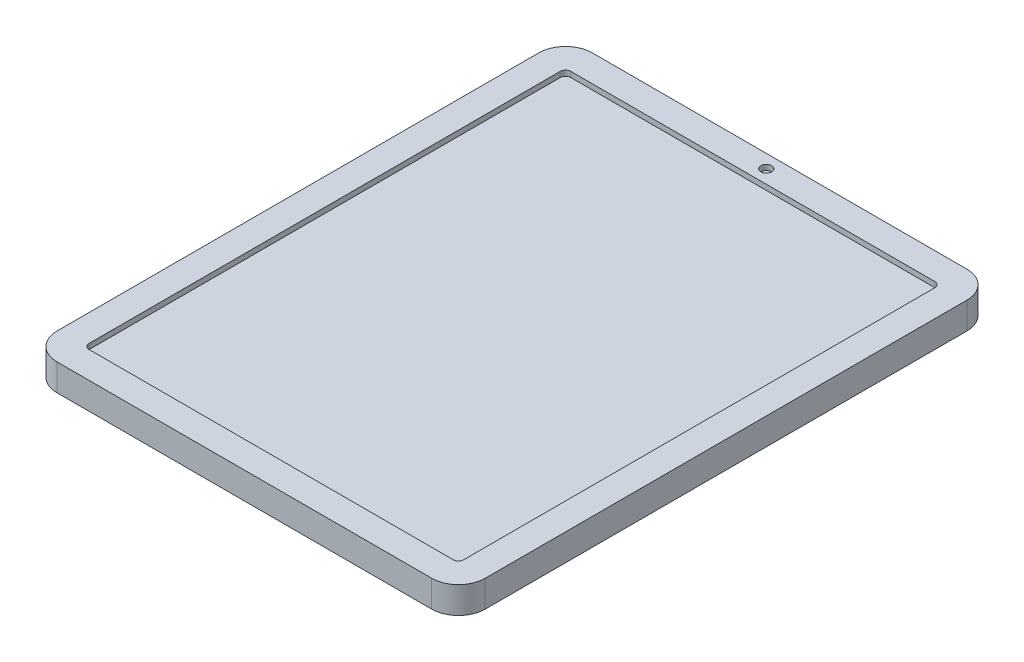
ISO-10303-21;
HEADER;
FILE_DESCRIPTION(('STEP AP214'),'2;1');
FILE_NAME('part.step','',(''),(''),'','','');
FILE_SCHEMA(('AUTOMOTIVE_DESIGN { 1 0 10303 214 1 1 1 1 }'));
ENDSEC;
DATA;
#1=APPLICATION_CONTEXT('core data for automotive mechanical design processes');
#2=APPLICATION_PROTOCOL_DEFINITION('international standard','automotive_design',2000,#1);
#3=PRODUCT_CONTEXT('',#1,'mechanical');
#4=PRODUCT('Part','Part','',(#3));
#5=PRODUCT_RELATED_PRODUCT_CATEGORY('part','',(#4));
#6=PRODUCT_DEFINITION_FORMATION('','',#4);
#7=PRODUCT_DEFINITION_CONTEXT('part definition',#1,'design');
#8=PRODUCT_DEFINITION('design','',#6,#7);
#9=PRODUCT_DEFINITION_SHAPE('','',#8);
#10=(LENGTH_UNIT() NAMED_UNIT(*) SI_UNIT(.MILLI.,.METRE.));
#11=(NAMED_UNIT(*) PLANE_ANGLE_UNIT() SI_UNIT($,.RADIAN.));
#12=(NAMED_UNIT(*) SI_UNIT($,.STERADIAN.) SOLID_ANGLE_UNIT());
#13=UNCERTAINTY_MEASURE_WITH_UNIT(LENGTH_MEASURE(1.E-05),#10,'distance_accuracy_value','');
#14=(GEOMETRIC_REPRESENTATION_CONTEXT(3) GLOBAL_UNCERTAINTY_ASSIGNED_CONTEXT((#13)) GLOBAL_UNIT_ASSIGNED_CONTEXT((#10,
#11,#12)) REPRESENTATION_CONTEXT('',''));
#15=CARTESIAN_POINT('',(0.,0.,0.));
#16=DIRECTION('',(0.,0.,1.));
#17=DIRECTION('',(1.,0.,0.));
#18=AXIS2_PLACEMENT_3D('',#15,#16,#17);
#19=CARTESIAN_POINT('',(-80.,10.,100.));
#20=DIRECTION('',(1.,0.,0.));
#21=DIRECTION('',(0.,0.,-1.));
#22=AXIS2_PLACEMENT_3D('',#19,#20,#21);
#23=PLANE('',#22);
#24=DIRECTION('',(0.,0.,1.));
#25=VECTOR('',#24,1.);
#26=CARTESIAN_POINT('',(-80.,10.,100.));
#27=LINE('',#26,#25);
#28=CARTESIAN_POINT('',(-80.,10.,-90.));
#29=VERTEX_POINT('',#28);
#30=CARTESIAN_POINT('',(-80.,10.,90.));
#31=VERTEX_POINT('',#30);
#32=EDGE_CURVE('E166',#29,#31,#27,.T.);
#33=ORIENTED_EDGE('',*,*,#32,.F.);
#34=DIRECTION('',(0.,-1.,0.));
#35=VECTOR('',#34,1.);
#36=CARTESIAN_POINT('',(-80.,10.,-90.));
#37=LINE('',#36,#35);
#38=CARTESIAN_POINT('',(-80.,0.,-90.));
#39=VERTEX_POINT('',#38);
#40=EDGE_CURVE('E151',#29,#39,#37,.T.);
#41=ORIENTED_EDGE('',*,*,#40,.T.);
#42=DIRECTION('',(0.,0.,1.));
#43=VECTOR('',#42,1.);
#44=CARTESIAN_POINT('',(-80.,0.,100.));
#45=LINE('',#44,#43);
#46=CARTESIAN_POINT('',(-80.,0.,90.));
#47=VERTEX_POINT('',#46);
#48=EDGE_CURVE('E163',#39,#47,#45,.T.);
#49=ORIENTED_EDGE('',*,*,#48,.T.);
#50=DIRECTION('',(0.,-1.,0.));
#51=VECTOR('',#50,1.);
#52=CARTESIAN_POINT('',(-80.,10.,90.));
#53=LINE('',#52,#51);
#54=EDGE_CURVE('E168',#47,#31,#53,.F.);
#55=ORIENTED_EDGE('',*,*,#54,.T.);
#56=EDGE_LOOP('',(#33,#41,#49,#55));
#57=FACE_BOUND('',#56,.T.);
#58=ADVANCED_FACE('F35',(#57),#23,.F.);
#59=CARTESIAN_POINT('',(-80.,10.,100.));
#60=DIRECTION('',(0.,0.,-1.));
#61=DIRECTION('',(-1.,0.,0.));
#62=AXIS2_PLACEMENT_3D('',#59,#60,#61);
#63=PLANE('',#62);
#64=DIRECTION('',(1.,0.,0.));
#65=VECTOR('',#64,1.);
#66=CARTESIAN_POINT('',(-80.,0.,100.));
#67=LINE('',#66,#65);
#68=CARTESIAN_POINT('',(-70.,0.,100.));
#69=VERTEX_POINT('',#68);
#70=CARTESIAN_POINT('',(70.,0.,100.));
#71=VERTEX_POINT('',#70);
#72=EDGE_CURVE('E172',#69,#71,#67,.T.);
#73=ORIENTED_EDGE('',*,*,#72,.T.);
#74=DIRECTION('',(0.,-1.,0.));
#75=VECTOR('',#74,1.);
#76=CARTESIAN_POINT('',(70.,10.,100.));
#77=LINE('',#76,#75);
#78=CARTESIAN_POINT('',(70.,10.,100.));
#79=VERTEX_POINT('',#78);
#80=EDGE_CURVE('E213',#71,#79,#77,.F.);
#81=ORIENTED_EDGE('',*,*,#80,.T.);
#82=DIRECTION('',(1.,0.,0.));
#83=VECTOR('',#82,1.);
#84=CARTESIAN_POINT('',(-80.,10.,100.));
#85=LINE('',#84,#83);
#86=CARTESIAN_POINT('',(-70.,10.,100.));
#87=VERTEX_POINT('',#86);
#88=EDGE_CURVE('E291',#87,#79,#85,.T.);
#89=ORIENTED_EDGE('',*,*,#88,.F.);
#90=DIRECTION('',(0.,-1.,0.));
#91=VECTOR('',#90,1.);
#92=CARTESIAN_POINT('',(-70.,10.,100.));
#93=LINE('',#92,#91);
#94=EDGE_CURVE('E210',#87,#69,#93,.T.);
#95=ORIENTED_EDGE('',*,*,#94,.T.);
#96=EDGE_LOOP('',(#73,#81,#89,#95));
#97=FACE_BOUND('',#96,.T.);
#98=ADVANCED_FACE('F315',(#97),#63,.F.);
#99=CARTESIAN_POINT('',(80.,10.,100.));
#100=DIRECTION('',(-1.,0.,0.));
#101=DIRECTION('',(0.,0.,1.));
#102=AXIS2_PLACEMENT_3D('',#99,#100,#101);
#103=PLANE('',#102);
#104=DIRECTION('',(0.,0.,-1.));
#105=VECTOR('',#104,1.);
#106=CARTESIAN_POINT('',(80.,0.,100.));
#107=LINE('',#106,#105);
#108=CARTESIAN_POINT('',(80.,0.,90.));
#109=VERTEX_POINT('',#108);
#110=CARTESIAN_POINT('',(80.,0.,-90.));
#111=VERTEX_POINT('',#110);
#112=EDGE_CURVE('E176',#109,#111,#107,.T.);
#113=ORIENTED_EDGE('',*,*,#112,.T.);
#114=DIRECTION('',(0.,-1.,0.));
#115=VECTOR('',#114,1.);
#116=CARTESIAN_POINT('',(80.,10.,-90.));
#117=LINE('',#116,#115);
#118=CARTESIAN_POINT('',(80.,10.,-90.));
#119=VERTEX_POINT('',#118);
#120=EDGE_CURVE('E208',#111,#119,#117,.F.);
#121=ORIENTED_EDGE('',*,*,#120,.T.);
#122=DIRECTION('',(0.,0.,-1.));
#123=VECTOR('',#122,1.);
#124=CARTESIAN_POINT('',(80.,10.,100.));
#125=LINE('',#124,#123);
#126=CARTESIAN_POINT('',(80.,10.,90.));
#127=VERTEX_POINT('',#126);
#128=EDGE_CURVE('E293',#127,#119,#125,.T.);
#129=ORIENTED_EDGE('',*,*,#128,.F.);
#130=DIRECTION('',(0.,-1.,0.));
#131=VECTOR('',#130,1.);
#132=CARTESIAN_POINT('',(80.,10.,90.));
#133=LINE('',#132,#131);
#134=EDGE_CURVE('E205',#127,#109,#133,.T.);
#135=ORIENTED_EDGE('',*,*,#134,.T.);
#136=EDGE_LOOP('',(#113,#121,#129,#135));
#137=FACE_BOUND('',#136,.T.);
#138=ADVANCED_FACE('F308',(#137),#103,.F.);
#139=CARTESIAN_POINT('',(-80.,10.,-100.));
#140=DIRECTION('',(0.,0.,1.));
#141=DIRECTION('',(1.,0.,0.));
#142=AXIS2_PLACEMENT_3D('',#139,#140,#141);
#143=PLANE('',#142);
#144=DIRECTION('',(-1.,0.,0.));
#145=VECTOR('',#144,1.);
#146=CARTESIAN_POINT('',(-80.,0.,-100.));
#147=LINE('',#146,#145);
#148=CARTESIAN_POINT('',(70.,0.,-100.));
#149=VERTEX_POINT('',#148);
#150=CARTESIAN_POINT('',(-70.,0.,-100.));
#151=VERTEX_POINT('',#150);
#152=EDGE_CURVE('E187',#149,#151,#147,.T.);
#153=ORIENTED_EDGE('',*,*,#152,.T.);
#154=DIRECTION('',(0.,-1.,0.));
#155=VECTOR('',#154,1.);
#156=CARTESIAN_POINT('',(-70.,10.,-100.));
#157=LINE('',#156,#155);
#158=CARTESIAN_POINT('',(-70.,10.,-100.));
#159=VERTEX_POINT('',#158);
#160=EDGE_CURVE('E152',#151,#159,#157,.F.);
#161=ORIENTED_EDGE('',*,*,#160,.T.);
#162=DIRECTION('',(-1.,0.,0.));
#163=VECTOR('',#162,1.);
#164=CARTESIAN_POINT('',(-80.,10.,-100.));
#165=LINE('',#164,#163);
#166=CARTESIAN_POINT('',(70.,10.,-100.));
#167=VERTEX_POINT('',#166);
#168=EDGE_CURVE('E182',#167,#159,#165,.T.);
#169=ORIENTED_EDGE('',*,*,#168,.F.);
#170=DIRECTION('',(0.,-1.,0.));
#171=VECTOR('',#170,1.);
#172=CARTESIAN_POINT('',(70.,10.,-100.));
#173=LINE('',#172,#171);
#174=EDGE_CURVE('E157',#167,#149,#173,.T.);
#175=ORIENTED_EDGE('',*,*,#174,.T.);
#176=EDGE_LOOP('',(#153,#161,#169,#175));
#177=FACE_BOUND('',#176,.T.);
#178=ADVANCED_FACE('F302',(#177),#143,.F.);
#179=CARTESIAN_POINT('',(0.,10.,0.));
#180=DIRECTION('',(0.,-1.,0.));
#181=DIRECTION('',(0.,0.,-1.));
#182=AXIS2_PLACEMENT_3D('',#179,#180,#181);
#183=PLANE('',#182);
#184=DIRECTION('',(1.,0.,0.));
#185=VECTOR('',#184,1.);
#186=CARTESIAN_POINT('',(-70.,10.,90.));
#187=LINE('',#186,#185);
#188=CARTESIAN_POINT('',(-68.,10.,90.));
#189=VERTEX_POINT('',#188);
#190=CARTESIAN_POINT('',(68.,10.,90.));
#191=VERTEX_POINT('',#190);
#192=EDGE_CURVE('E280',#189,#191,#187,.T.);
#193=ORIENTED_EDGE('',*,*,#192,.F.);
#194=CARTESIAN_POINT('',(-68.,10.,88.));
#195=DIRECTION('',(0.,-1.,0.));
#196=DIRECTION('',(0.,0.,-1.));
#197=AXIS2_PLACEMENT_3D('',#194,#195,#196);
#198=CIRCLE('',#197,2.);
#199=CARTESIAN_POINT('',(-70.,10.,88.));
#200=VERTEX_POINT('',#199);
#201=EDGE_CURVE('E11',#189,#200,#198,.T.);
#202=ORIENTED_EDGE('',*,*,#201,.T.);
#203=DIRECTION('',(0.,0.,1.));
#204=VECTOR('',#203,1.);
#205=CARTESIAN_POINT('',(-70.,10.,90.));
#206=LINE('',#205,#204);
#207=CARTESIAN_POINT('',(-70.,10.,-87.9999999999999));
#208=VERTEX_POINT('',#207);
#209=EDGE_CURVE('E252',#208,#200,#206,.T.);
#210=ORIENTED_EDGE('',*,*,#209,.F.);
#211=CARTESIAN_POINT('',(-68.,10.,-88.));
#212=DIRECTION('',(0.,-1.,0.));
#213=DIRECTION('',(0.,0.,-1.));
#214=AXIS2_PLACEMENT_3D('',#211,#212,#213);
#215=CIRCLE('',#214,2.);
#216=CARTESIAN_POINT('',(-68.,10.,-90.));
#217=VERTEX_POINT('',#216);
#218=EDGE_CURVE('E244',#208,#217,#215,.T.);
#219=ORIENTED_EDGE('',*,*,#218,.T.);
#220=DIRECTION('',(-1.,0.,0.));
#221=VECTOR('',#220,1.);
#222=CARTESIAN_POINT('',(-70.,10.,-90.));
#223=LINE('',#222,#221);
#224=CARTESIAN_POINT('',(68.,10.,-90.));
#225=VERTEX_POINT('',#224);
#226=EDGE_CURVE('E250',#225,#217,#223,.T.);
#227=ORIENTED_EDGE('',*,*,#226,.F.);
#228=CARTESIAN_POINT('',(68.,10.,-88.));
#229=DIRECTION('',(0.,-1.,0.));
#230=DIRECTION('',(0.,0.,-1.));
#231=AXIS2_PLACEMENT_3D('',#228,#229,#230);
#232=CIRCLE('',#231,2.);
#233=CARTESIAN_POINT('',(70.,10.,-87.9999999999999));
#234=VERTEX_POINT('',#233);
#235=EDGE_CURVE('E242',#225,#234,#232,.T.);
#236=ORIENTED_EDGE('',*,*,#235,.T.);
#237=DIRECTION('',(0.,0.,-1.));
#238=VECTOR('',#237,1.);
#239=CARTESIAN_POINT('',(70.,10.,90.));
#240=LINE('',#239,#238);
#241=CARTESIAN_POINT('',(70.,10.,88.));
#242=VERTEX_POINT('',#241);
#243=EDGE_CURVE('E261',#242,#234,#240,.T.);
#244=ORIENTED_EDGE('',*,*,#243,.F.);
#245=CARTESIAN_POINT('',(68.,10.,88.));
#246=DIRECTION('',(0.,-1.,0.));
#247=DIRECTION('',(0.,0.,-1.));
#248=AXIS2_PLACEMENT_3D('',#245,#246,#247);
#249=CIRCLE('',#248,2.);
#250=EDGE_CURVE('E43',#242,#191,#249,.T.);
#251=ORIENTED_EDGE('',*,*,#250,.T.);
#252=EDGE_LOOP('',(#193,#202,#210,#219,#227,#236,#244,#251));
#253=FACE_BOUND('',#252,.T.);
#254=CARTESIAN_POINT('',(0.,10.,-95.));
#255=DIRECTION('',(0.,1.,0.));
#256=DIRECTION('',(0.,0.,1.));
#257=AXIS2_PLACEMENT_3D('',#254,#255,#256);
#258=CIRCLE('',#257,2.);
#259=CARTESIAN_POINT('',(0.,10.,-93.));
#260=VERTEX_POINT('',#259);
#261=EDGE_CURVE('E287',#260,#260,#258,.T.);
#262=ORIENTED_EDGE('',*,*,#261,.F.);
#263=EDGE_LOOP('',(#262));
#264=FACE_BOUND('',#263,.T.);
#265=ORIENTED_EDGE('',*,*,#168,.T.);
#266=CARTESIAN_POINT('',(-70.,10.,-90.));
#267=DIRECTION('',(0.,-1.,0.));
#268=DIRECTION('',(0.,0.,-1.));
#269=AXIS2_PLACEMENT_3D('',#266,#267,#268);
#270=CIRCLE('',#269,10.);
#271=EDGE_CURVE('E203',#159,#29,#270,.F.);
#272=ORIENTED_EDGE('',*,*,#271,.T.);
#273=ORIENTED_EDGE('',*,*,#32,.T.);
#274=CARTESIAN_POINT('',(-70.,10.,90.));
#275=DIRECTION('',(0.,-1.,0.));
#276=DIRECTION('',(0.,0.,-1.));
#277=AXIS2_PLACEMENT_3D('',#274,#275,#276);
#278=CIRCLE('',#277,10.);
#279=EDGE_CURVE('E197',#31,#87,#278,.F.);
#280=ORIENTED_EDGE('',*,*,#279,.T.);
#281=ORIENTED_EDGE('',*,*,#88,.T.);
#282=CARTESIAN_POINT('',(70.,10.,90.));
#283=DIRECTION('',(0.,-1.,0.));
#284=DIRECTION('',(0.,0.,-1.));
#285=AXIS2_PLACEMENT_3D('',#282,#283,#284);
#286=CIRCLE('',#285,10.);
#287=EDGE_CURVE('E199',#79,#127,#286,.F.);
#288=ORIENTED_EDGE('',*,*,#287,.T.);
#289=ORIENTED_EDGE('',*,*,#128,.T.);
#290=CARTESIAN_POINT('',(70.,10.,-90.));
#291=DIRECTION('',(0.,-1.,0.));
#292=DIRECTION('',(0.,0.,-1.));
#293=AXIS2_PLACEMENT_3D('',#290,#291,#292);
#294=CIRCLE('',#293,10.);
#295=EDGE_CURVE('E201',#119,#167,#294,.F.);
#296=ORIENTED_EDGE('',*,*,#295,.T.);
#297=EDGE_LOOP('',(#265,#272,#273,#280,#281,#288,#289,#296));
#298=FACE_BOUND('',#297,.T.);
#299=ADVANCED_FACE('F248',(#253,#264,#298),#183,.F.);
#300=CARTESIAN_POINT('',(0.,0.,0.));
#301=DIRECTION('',(0.,-1.,0.));
#302=DIRECTION('',(0.,0.,-1.));
#303=AXIS2_PLACEMENT_3D('',#300,#301,#302);
#304=PLANE('',#303);
#305=ORIENTED_EDGE('',*,*,#48,.F.);
#306=CARTESIAN_POINT('',(-70.,0.,-90.));
#307=DIRECTION('',(0.,-1.,0.));
#308=DIRECTION('',(0.,0.,-1.));
#309=AXIS2_PLACEMENT_3D('',#306,#307,#308);
#310=CIRCLE('',#309,10.);
#311=EDGE_CURVE('E147',#39,#151,#310,.T.);
#312=ORIENTED_EDGE('',*,*,#311,.T.);
#313=ORIENTED_EDGE('',*,*,#152,.F.);
#314=CARTESIAN_POINT('',(70.,0.,-90.));
#315=DIRECTION('',(0.,-1.,0.));
#316=DIRECTION('',(0.,0.,-1.));
#317=AXIS2_PLACEMENT_3D('',#314,#315,#316);
#318=CIRCLE('',#317,10.);
#319=EDGE_CURVE('E158',#149,#111,#318,.T.);
#320=ORIENTED_EDGE('',*,*,#319,.T.);
#321=ORIENTED_EDGE('',*,*,#112,.F.);
#322=CARTESIAN_POINT('',(70.,0.,90.));
#323=DIRECTION('',(0.,-1.,0.));
#324=DIRECTION('',(0.,0.,-1.));
#325=AXIS2_PLACEMENT_3D('',#322,#323,#324);
#326=CIRCLE('',#325,10.);
#327=EDGE_CURVE('E191',#109,#71,#326,.T.);
#328=ORIENTED_EDGE('',*,*,#327,.T.);
#329=ORIENTED_EDGE('',*,*,#72,.F.);
#330=CARTESIAN_POINT('',(-70.,0.,90.));
#331=DIRECTION('',(0.,-1.,0.));
#332=DIRECTION('',(0.,0.,-1.));
#333=AXIS2_PLACEMENT_3D('',#330,#331,#332);
#334=CIRCLE('',#333,10.);
#335=EDGE_CURVE('E167',#69,#47,#334,.T.);
#336=ORIENTED_EDGE('',*,*,#335,.T.);
#337=EDGE_LOOP('',(#305,#312,#313,#320,#321,#328,#329,#336));
#338=FACE_BOUND('',#337,.T.);
#339=ADVANCED_FACE('F170',(#338),#304,.T.);
#340=CARTESIAN_POINT('',(0.,8.,-95.));
#341=DIRECTION('',(0.,1.,0.));
#342=DIRECTION('',(0.,0.,1.));
#343=AXIS2_PLACEMENT_3D('',#340,#341,#342);
#344=CYLINDRICAL_SURFACE('',#343,2.);
#345=CARTESIAN_POINT('',(0.,8.,-95.));
#346=DIRECTION('',(0.,1.,0.));
#347=DIRECTION('',(0.,0.,1.));
#348=AXIS2_PLACEMENT_3D('',#345,#346,#347);
#349=CIRCLE('',#348,2.);
#350=CARTESIAN_POINT('',(0.,8.,-93.));
#351=VERTEX_POINT('',#350);
#352=EDGE_CURVE('E281',#351,#351,#349,.T.);
#353=ORIENTED_EDGE('',*,*,#352,.F.);
#354=EDGE_LOOP('',(#353));
#355=FACE_BOUND('',#354,.T.);
#356=ORIENTED_EDGE('',*,*,#261,.T.);
#357=EDGE_LOOP('',(#356));
#358=FACE_BOUND('',#357,.T.);
#359=ADVANCED_FACE('F463',(#355,#358),#344,.F.);
#360=CARTESIAN_POINT('',(0.,8.,-95.));
#361=DIRECTION('',(0.,1.,0.));
#362=DIRECTION('',(0.,0.,1.));
#363=AXIS2_PLACEMENT_3D('',#360,#361,#362);
#364=PLANE('',#363);
#365=ORIENTED_EDGE('',*,*,#352,.T.);
#366=EDGE_LOOP('',(#365));
#367=FACE_BOUND('',#366,.T.);
#368=ADVANCED_FACE('F377',(#367),#364,.T.);
#369=CARTESIAN_POINT('',(-70.,8.,90.));
#370=DIRECTION('',(-1.,0.,0.));
#371=DIRECTION('',(0.,0.,1.));
#372=AXIS2_PLACEMENT_3D('',#369,#370,#371);
#373=PLANE('',#372);
#374=DIRECTION('',(0.,0.,1.));
#375=VECTOR('',#374,1.);
#376=CARTESIAN_POINT('',(-70.,8.,90.));
#377=LINE('',#376,#375);
#378=CARTESIAN_POINT('',(-70.,8.,-87.9999999999999));
#379=VERTEX_POINT('',#378);
#380=CARTESIAN_POINT('',(-70.,8.,88.));
#381=VERTEX_POINT('',#380);
#382=EDGE_CURVE('E260',#379,#381,#377,.T.);
#383=ORIENTED_EDGE('',*,*,#382,.F.);
#384=DIRECTION('',(0.,1.,0.));
#385=VECTOR('',#384,1.);
#386=CARTESIAN_POINT('',(-70.,10.,-88.));
#387=LINE('',#386,#385);
#388=EDGE_CURVE('E235',#379,#208,#387,.T.);
#389=ORIENTED_EDGE('',*,*,#388,.T.);
#390=ORIENTED_EDGE('',*,*,#209,.T.);
#391=DIRECTION('',(0.,1.,0.));
#392=VECTOR('',#391,1.);
#393=CARTESIAN_POINT('',(-70.,8.,88.));
#394=LINE('',#393,#392);
#395=EDGE_CURVE('E233',#200,#381,#394,.F.);
#396=ORIENTED_EDGE('',*,*,#395,.T.);
#397=EDGE_LOOP('',(#383,#389,#390,#396));
#398=FACE_BOUND('',#397,.T.);
#399=ADVANCED_FACE('F272',(#398),#373,.F.);
#400=CARTESIAN_POINT('',(-70.,8.,-90.));
#401=DIRECTION('',(0.,0.,-1.));
#402=DIRECTION('',(-1.,0.,0.));
#403=AXIS2_PLACEMENT_3D('',#400,#401,#402);
#404=PLANE('',#403);
#405=DIRECTION('',(-1.,0.,0.));
#406=VECTOR('',#405,1.);
#407=CARTESIAN_POINT('',(-70.,8.,-90.));
#408=LINE('',#407,#406);
#409=CARTESIAN_POINT('',(68.,8.,-90.));
#410=VERTEX_POINT('',#409);
#411=CARTESIAN_POINT('',(-68.,8.,-90.));
#412=VERTEX_POINT('',#411);
#413=EDGE_CURVE('E173',#410,#412,#408,.T.);
#414=ORIENTED_EDGE('',*,*,#413,.F.);
#415=DIRECTION('',(0.,1.,0.));
#416=VECTOR('',#415,1.);
#417=CARTESIAN_POINT('',(68.,10.,-90.));
#418=LINE('',#417,#416);
#419=EDGE_CURVE('E217',#410,#225,#418,.T.);
#420=ORIENTED_EDGE('',*,*,#419,.T.);
#421=ORIENTED_EDGE('',*,*,#226,.T.);
#422=DIRECTION('',(0.,1.,0.));
#423=VECTOR('',#422,1.);
#424=CARTESIAN_POINT('',(-68.,8.,-90.));
#425=LINE('',#424,#423);
#426=EDGE_CURVE('E215',#217,#412,#425,.F.);
#427=ORIENTED_EDGE('',*,*,#426,.T.);
#428=EDGE_LOOP('',(#414,#420,#421,#427));
#429=FACE_BOUND('',#428,.T.);
#430=ADVANCED_FACE('F258',(#429),#404,.F.);
#431=CARTESIAN_POINT('',(70.,8.,90.));
#432=DIRECTION('',(1.,0.,0.));
#433=DIRECTION('',(0.,0.,-1.));
#434=AXIS2_PLACEMENT_3D('',#431,#432,#433);
#435=PLANE('',#434);
#436=ORIENTED_EDGE('',*,*,#243,.T.);
#437=DIRECTION('',(0.,1.,0.));
#438=VECTOR('',#437,1.);
#439=CARTESIAN_POINT('',(70.,8.,-88.));
#440=LINE('',#439,#438);
#441=CARTESIAN_POINT('',(70.,8.,-87.9999999999999));
#442=VERTEX_POINT('',#441);
#443=EDGE_CURVE('E223',#234,#442,#440,.F.);
#444=ORIENTED_EDGE('',*,*,#443,.T.);
#445=DIRECTION('',(0.,0.,-1.));
#446=VECTOR('',#445,1.);
#447=CARTESIAN_POINT('',(70.,8.,90.));
#448=LINE('',#447,#446);
#449=CARTESIAN_POINT('',(70.,8.,88.));
#450=VERTEX_POINT('',#449);
#451=EDGE_CURVE('E179',#450,#442,#448,.T.);
#452=ORIENTED_EDGE('',*,*,#451,.F.);
#453=DIRECTION('',(0.,1.,0.));
#454=VECTOR('',#453,1.);
#455=CARTESIAN_POINT('',(70.,10.,88.));
#456=LINE('',#455,#454);
#457=EDGE_CURVE('E220',#450,#242,#456,.T.);
#458=ORIENTED_EDGE('',*,*,#457,.T.);
#459=EDGE_LOOP('',(#436,#444,#452,#458));
#460=FACE_BOUND('',#459,.T.);
#461=ADVANCED_FACE('F388',(#460),#435,.F.);
#462=CARTESIAN_POINT('',(-70.,8.,90.));
#463=DIRECTION('',(0.,0.,1.));
#464=DIRECTION('',(1.,0.,0.));
#465=AXIS2_PLACEMENT_3D('',#462,#463,#464);
#466=PLANE('',#465);
#467=ORIENTED_EDGE('',*,*,#192,.T.);
#468=DIRECTION('',(0.,1.,0.));
#469=VECTOR('',#468,1.);
#470=CARTESIAN_POINT('',(68.,8.,90.));
#471=LINE('',#470,#469);
#472=CARTESIAN_POINT('',(68.,8.,90.));
#473=VERTEX_POINT('',#472);
#474=EDGE_CURVE('E240',#191,#473,#471,.F.);
#475=ORIENTED_EDGE('',*,*,#474,.T.);
#476=DIRECTION('',(1.,0.,0.));
#477=VECTOR('',#476,1.);
#478=CARTESIAN_POINT('',(-70.,8.,90.));
#479=LINE('',#478,#477);
#480=CARTESIAN_POINT('',(-68.,8.,90.));
#481=VERTEX_POINT('',#480);
#482=EDGE_CURVE('E273',#481,#473,#479,.T.);
#483=ORIENTED_EDGE('',*,*,#482,.F.);
#484=DIRECTION('',(0.,1.,0.));
#485=VECTOR('',#484,1.);
#486=CARTESIAN_POINT('',(-68.,10.,90.));
#487=LINE('',#486,#485);
#488=EDGE_CURVE('E238',#481,#189,#487,.T.);
#489=ORIENTED_EDGE('',*,*,#488,.T.);
#490=EDGE_LOOP('',(#467,#475,#483,#489));
#491=FACE_BOUND('',#490,.T.);
#492=ADVANCED_FACE('F397',(#491),#466,.F.);
#493=CARTESIAN_POINT('',(0.,8.,0.));
#494=DIRECTION('',(0.,-1.,0.));
#495=DIRECTION('',(0.,0.,-1.));
#496=AXIS2_PLACEMENT_3D('',#493,#494,#495);
#497=PLANE('',#496);
#498=ORIENTED_EDGE('',*,*,#451,.T.);
#499=CARTESIAN_POINT('',(68.,8.,-88.));
#500=DIRECTION('',(0.,-1.,0.));
#501=DIRECTION('',(0.,0.,-1.));
#502=AXIS2_PLACEMENT_3D('',#499,#500,#501);
#503=CIRCLE('',#502,2.);
#504=EDGE_CURVE('E231',#442,#410,#503,.F.);
#505=ORIENTED_EDGE('',*,*,#504,.T.);
#506=ORIENTED_EDGE('',*,*,#413,.T.);
#507=CARTESIAN_POINT('',(-68.,8.,-88.));
#508=DIRECTION('',(0.,-1.,0.));
#509=DIRECTION('',(0.,0.,-1.));
#510=AXIS2_PLACEMENT_3D('',#507,#508,#509);
#511=CIRCLE('',#510,2.);
#512=EDGE_CURVE('E229',#412,#379,#511,.F.);
#513=ORIENTED_EDGE('',*,*,#512,.T.);
#514=ORIENTED_EDGE('',*,*,#382,.T.);
#515=CARTESIAN_POINT('',(-68.,8.,88.));
#516=DIRECTION('',(0.,-1.,0.));
#517=DIRECTION('',(0.,0.,-1.));
#518=AXIS2_PLACEMENT_3D('',#515,#516,#517);
#519=CIRCLE('',#518,2.);
#520=EDGE_CURVE('E225',#381,#481,#519,.F.);
#521=ORIENTED_EDGE('',*,*,#520,.T.);
#522=ORIENTED_EDGE('',*,*,#482,.T.);
#523=CARTESIAN_POINT('',(68.,8.,88.));
#524=DIRECTION('',(0.,-1.,0.));
#525=DIRECTION('',(0.,0.,-1.));
#526=AXIS2_PLACEMENT_3D('',#523,#524,#525);
#527=CIRCLE('',#526,2.);
#528=EDGE_CURVE('E227',#473,#450,#527,.F.);
#529=ORIENTED_EDGE('',*,*,#528,.T.);
#530=EDGE_LOOP('',(#498,#505,#506,#513,#514,#521,#522,#529));
#531=FACE_BOUND('',#530,.T.);
#532=ADVANCED_FACE('F269',(#531),#497,.F.);
#533=CARTESIAN_POINT('',(-70.,10.,-90.));
#534=DIRECTION('',(0.,-1.,0.));
#535=DIRECTION('',(0.,0.,-1.));
#536=AXIS2_PLACEMENT_3D('',#533,#534,#535);
#537=CYLINDRICAL_SURFACE('',#536,10.);
#538=ORIENTED_EDGE('',*,*,#271,.F.);
#539=ORIENTED_EDGE('',*,*,#160,.F.);
#540=ORIENTED_EDGE('',*,*,#311,.F.);
#541=ORIENTED_EDGE('',*,*,#40,.F.);
#542=EDGE_LOOP('',(#538,#539,#540,#541));
#543=FACE_BOUND('',#542,.T.);
#544=ADVANCED_FACE('F150',(#543),#537,.T.);
#545=CARTESIAN_POINT('',(70.,10.,-90.));
#546=DIRECTION('',(0.,-1.,0.));
#547=DIRECTION('',(0.,0.,-1.));
#548=AXIS2_PLACEMENT_3D('',#545,#546,#547);
#549=CYLINDRICAL_SURFACE('',#548,10.);
#550=ORIENTED_EDGE('',*,*,#295,.F.);
#551=ORIENTED_EDGE('',*,*,#120,.F.);
#552=ORIENTED_EDGE('',*,*,#319,.F.);
#553=ORIENTED_EDGE('',*,*,#174,.F.);
#554=EDGE_LOOP('',(#550,#551,#552,#553));
#555=FACE_BOUND('',#554,.T.);
#556=ADVANCED_FACE('F304',(#555),#549,.T.);
#557=CARTESIAN_POINT('',(70.,10.,90.));
#558=DIRECTION('',(0.,-1.,0.));
#559=DIRECTION('',(0.,0.,-1.));
#560=AXIS2_PLACEMENT_3D('',#557,#558,#559);
#561=CYLINDRICAL_SURFACE('',#560,10.);
#562=ORIENTED_EDGE('',*,*,#287,.F.);
#563=ORIENTED_EDGE('',*,*,#80,.F.);
#564=ORIENTED_EDGE('',*,*,#327,.F.);
#565=ORIENTED_EDGE('',*,*,#134,.F.);
#566=EDGE_LOOP('',(#562,#563,#564,#565));
#567=FACE_BOUND('',#566,.T.);
#568=ADVANCED_FACE('F312',(#567),#561,.T.);
#569=CARTESIAN_POINT('',(-70.,10.,90.));
#570=DIRECTION('',(0.,-1.,0.));
#571=DIRECTION('',(0.,0.,-1.));
#572=AXIS2_PLACEMENT_3D('',#569,#570,#571);
#573=CYLINDRICAL_SURFACE('',#572,10.);
#574=ORIENTED_EDGE('',*,*,#279,.F.);
#575=ORIENTED_EDGE('',*,*,#54,.F.);
#576=ORIENTED_EDGE('',*,*,#335,.F.);
#577=ORIENTED_EDGE('',*,*,#94,.F.);
#578=EDGE_LOOP('',(#574,#575,#576,#577));
#579=FACE_BOUND('',#578,.T.);
#580=ADVANCED_FACE('F320',(#579),#573,.T.);
#581=CARTESIAN_POINT('',(68.,8.,-88.));
#582=DIRECTION('',(0.,-1.,0.));
#583=DIRECTION('',(0.,0.,-1.));
#584=AXIS2_PLACEMENT_3D('',#581,#582,#583);
#585=CYLINDRICAL_SURFACE('',#584,2.);
#586=ORIENTED_EDGE('',*,*,#504,.F.);
#587=ORIENTED_EDGE('',*,*,#443,.F.);
#588=ORIENTED_EDGE('',*,*,#235,.F.);
#589=ORIENTED_EDGE('',*,*,#419,.F.);
#590=EDGE_LOOP('',(#586,#587,#588,#589));
#591=FACE_BOUND('',#590,.T.);
#592=ADVANCED_FACE('F322',(#591),#585,.F.);
#593=CARTESIAN_POINT('',(-68.,8.,-88.));
#594=DIRECTION('',(0.,-1.,0.));
#595=DIRECTION('',(0.,0.,-1.));
#596=AXIS2_PLACEMENT_3D('',#593,#594,#595);
#597=CYLINDRICAL_SURFACE('',#596,2.);
#598=ORIENTED_EDGE('',*,*,#512,.F.);
#599=ORIENTED_EDGE('',*,*,#426,.F.);
#600=ORIENTED_EDGE('',*,*,#218,.F.);
#601=ORIENTED_EDGE('',*,*,#388,.F.);
#602=EDGE_LOOP('',(#598,#599,#600,#601));
#603=FACE_BOUND('',#602,.T.);
#604=ADVANCED_FACE('F264',(#603),#597,.F.);
#605=CARTESIAN_POINT('',(68.,8.,88.));
#606=DIRECTION('',(0.,-1.,0.));
#607=DIRECTION('',(0.,0.,-1.));
#608=AXIS2_PLACEMENT_3D('',#605,#606,#607);
#609=CYLINDRICAL_SURFACE('',#608,2.);
#610=ORIENTED_EDGE('',*,*,#528,.F.);
#611=ORIENTED_EDGE('',*,*,#474,.F.);
#612=ORIENTED_EDGE('',*,*,#250,.F.);
#613=ORIENTED_EDGE('',*,*,#457,.F.);
#614=EDGE_LOOP('',(#610,#611,#612,#613));
#615=FACE_BOUND('',#614,.T.);
#616=ADVANCED_FACE('F429',(#615),#609,.F.);
#617=CARTESIAN_POINT('',(-68.,8.,88.));
#618=DIRECTION('',(0.,-1.,0.));
#619=DIRECTION('',(0.,0.,-1.));
#620=AXIS2_PLACEMENT_3D('',#617,#618,#619);
#621=CYLINDRICAL_SURFACE('',#620,2.);
#622=ORIENTED_EDGE('',*,*,#520,.F.);
#623=ORIENTED_EDGE('',*,*,#395,.F.);
#624=ORIENTED_EDGE('',*,*,#201,.F.);
#625=ORIENTED_EDGE('',*,*,#488,.F.);
#626=EDGE_LOOP('',(#622,#623,#624,#625));
#627=FACE_BOUND('',#626,.T.);
#628=ADVANCED_FACE('F37',(#627),#621,.F.);
#629=CLOSED_SHELL('',(#58,#98,#138,#178,#299,#339,#359,#368,#399,#430,#461,#492,#532,#544,#556,
#568,#580,#592,#604,#616,#628));
#630=MANIFOLD_SOLID_BREP('B2',#629);
#631=ADVANCED_BREP_SHAPE_REPRESENTATION('',(#18,#630),#14);
#632=SHAPE_DEFINITION_REPRESENTATION(#9,#631);
ENDSEC;
END-ISO-10303-21;
